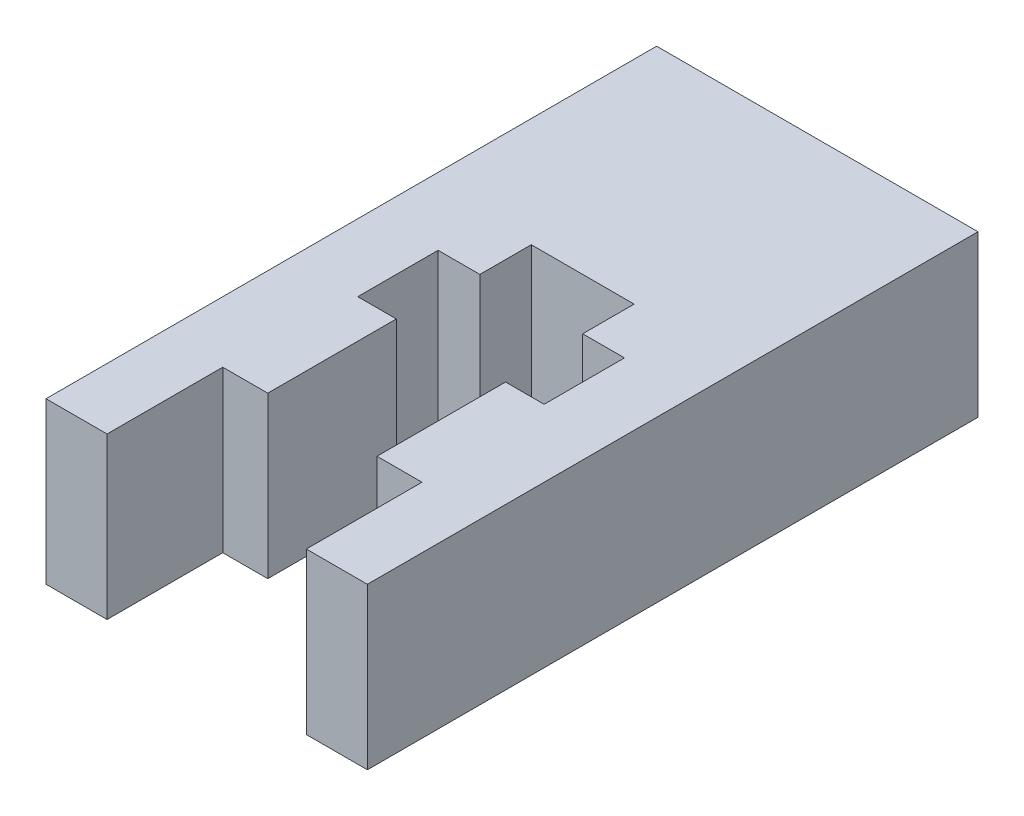
ISO-10303-21;
HEADER;
FILE_DESCRIPTION(('STEP AP214'),'2;1');
FILE_NAME('part.step','',(''),(''),'','','');
FILE_SCHEMA(('AUTOMOTIVE_DESIGN { 1 0 10303 214 1 1 1 1 }'));
ENDSEC;
DATA;
#1=APPLICATION_CONTEXT('core data for automotive mechanical design processes');
#2=APPLICATION_PROTOCOL_DEFINITION('international standard','automotive_design',2000,#1);
#3=PRODUCT_CONTEXT('',#1,'mechanical');
#4=PRODUCT('Part','Part','',(#3));
#5=PRODUCT_RELATED_PRODUCT_CATEGORY('part','',(#4));
#6=PRODUCT_DEFINITION_FORMATION('','',#4);
#7=PRODUCT_DEFINITION_CONTEXT('part definition',#1,'design');
#8=PRODUCT_DEFINITION('design','',#6,#7);
#9=PRODUCT_DEFINITION_SHAPE('','',#8);
#10=(LENGTH_UNIT() NAMED_UNIT(*) SI_UNIT(.MILLI.,.METRE.));
#11=(NAMED_UNIT(*) PLANE_ANGLE_UNIT() SI_UNIT($,.RADIAN.));
#12=(NAMED_UNIT(*) SI_UNIT($,.STERADIAN.) SOLID_ANGLE_UNIT());
#13=UNCERTAINTY_MEASURE_WITH_UNIT(LENGTH_MEASURE(1.E-05),#10,'distance_accuracy_value','');
#14=(GEOMETRIC_REPRESENTATION_CONTEXT(3) GLOBAL_UNCERTAINTY_ASSIGNED_CONTEXT((#13)) GLOBAL_UNIT_ASSIGNED_CONTEXT((#10,
#11,#12)) REPRESENTATION_CONTEXT('',''));
#15=CARTESIAN_POINT('',(0.,0.,0.));
#16=DIRECTION('',(0.,0.,1.));
#17=DIRECTION('',(1.,0.,0.));
#18=AXIS2_PLACEMENT_3D('',#15,#16,#17);
#19=CARTESIAN_POINT('',(1.6,5.,0.));
#20=DIRECTION('',(-1.,0.,0.));
#21=DIRECTION('',(0.,0.,1.));
#22=AXIS2_PLACEMENT_3D('',#19,#20,#21);
#23=PLANE('',#22);
#24=DIRECTION('',(0.,0.,-1.));
#25=VECTOR('',#24,1.);
#26=CARTESIAN_POINT('',(1.6,0.,0.));
#27=LINE('',#26,#25);
#28=CARTESIAN_POINT('',(1.6,0.,-0.600000000000002));
#29=VERTEX_POINT('',#28);
#30=CARTESIAN_POINT('',(1.6,0.,-2.2));
#31=VERTEX_POINT('',#30);
#32=EDGE_CURVE('E200',#29,#31,#27,.T.);
#33=ORIENTED_EDGE('',*,*,#32,.F.);
#34=DIRECTION('',(0.,-1.,0.));
#35=VECTOR('',#34,1.);
#36=CARTESIAN_POINT('',(1.6,5.,-0.600000000000002));
#37=LINE('',#36,#35);
#38=CARTESIAN_POINT('',(1.6,5.,-0.600000000000002));
#39=VERTEX_POINT('',#38);
#40=EDGE_CURVE('E11',#39,#29,#37,.T.);
#41=ORIENTED_EDGE('',*,*,#40,.F.);
#42=DIRECTION('',(0.,0.,-1.));
#43=VECTOR('',#42,1.);
#44=CARTESIAN_POINT('',(1.6,5.,0.));
#45=LINE('',#44,#43);
#46=CARTESIAN_POINT('',(1.6,5.,-2.2));
#47=VERTEX_POINT('',#46);
#48=EDGE_CURVE('E248',#39,#47,#45,.T.);
#49=ORIENTED_EDGE('',*,*,#48,.T.);
#50=DIRECTION('',(0.,-1.,0.));
#51=VECTOR('',#50,1.);
#52=CARTESIAN_POINT('',(1.6,5.,-2.2));
#53=LINE('',#52,#51);
#54=EDGE_CURVE('E123',#47,#31,#53,.T.);
#55=ORIENTED_EDGE('',*,*,#54,.T.);
#56=EDGE_LOOP('',(#33,#41,#49,#55));
#57=FACE_BOUND('',#56,.T.);
#58=ADVANCED_FACE('F36',(#57),#23,.T.);
#59=CARTESIAN_POINT('',(0.,5.,-0.600000000000001));
#60=DIRECTION('',(0.,0.,1.));
#61=DIRECTION('',(1.,0.,0.));
#62=AXIS2_PLACEMENT_3D('',#59,#60,#61);
#63=PLANE('',#62);
#64=DIRECTION('',(-1.,0.,0.));
#65=VECTOR('',#64,1.);
#66=CARTESIAN_POINT('',(0.,0.,-0.600000000000001));
#67=LINE('',#66,#65);
#68=CARTESIAN_POINT('',(2.9,0.,-0.600000000000003));
#69=VERTEX_POINT('',#68);
#70=EDGE_CURVE('E203',#69,#29,#67,.T.);
#71=ORIENTED_EDGE('',*,*,#70,.F.);
#72=DIRECTION('',(0.,-1.,0.));
#73=VECTOR('',#72,1.);
#74=CARTESIAN_POINT('',(2.9,5.,-0.600000000000003));
#75=LINE('',#74,#73);
#76=CARTESIAN_POINT('',(2.9,5.,-0.600000000000003));
#77=VERTEX_POINT('',#76);
#78=EDGE_CURVE('E44',#77,#69,#75,.T.);
#79=ORIENTED_EDGE('',*,*,#78,.F.);
#80=DIRECTION('',(-1.,0.,0.));
#81=VECTOR('',#80,1.);
#82=CARTESIAN_POINT('',(0.,5.,-0.600000000000001));
#83=LINE('',#82,#81);
#84=EDGE_CURVE('E307',#77,#39,#83,.T.);
#85=ORIENTED_EDGE('',*,*,#84,.T.);
#86=ORIENTED_EDGE('',*,*,#40,.T.);
#87=EDGE_LOOP('',(#71,#79,#85,#86));
#88=FACE_BOUND('',#87,.T.);
#89=ADVANCED_FACE('F295',(#88),#63,.T.);
#90=CARTESIAN_POINT('',(2.9,5.,0.));
#91=DIRECTION('',(-1.,0.,0.));
#92=DIRECTION('',(0.,0.,1.));
#93=AXIS2_PLACEMENT_3D('',#90,#91,#92);
#94=PLANE('',#93);
#95=DIRECTION('',(0.,0.,-1.));
#96=VECTOR('',#95,1.);
#97=CARTESIAN_POINT('',(2.9,0.,0.));
#98=LINE('',#97,#96);
#99=CARTESIAN_POINT('',(2.9,0.,1.9));
#100=VERTEX_POINT('',#99);
#101=EDGE_CURVE('E206',#100,#69,#98,.T.);
#102=ORIENTED_EDGE('',*,*,#101,.F.);
#103=DIRECTION('',(0.,-1.,0.));
#104=VECTOR('',#103,1.);
#105=CARTESIAN_POINT('',(2.9,5.,1.9));
#106=LINE('',#105,#104);
#107=CARTESIAN_POINT('',(2.9,5.,1.9));
#108=VERTEX_POINT('',#107);
#109=EDGE_CURVE('E284',#108,#100,#106,.T.);
#110=ORIENTED_EDGE('',*,*,#109,.F.);
#111=DIRECTION('',(0.,0.,-1.));
#112=VECTOR('',#111,1.);
#113=CARTESIAN_POINT('',(2.9,5.,0.));
#114=LINE('',#113,#112);
#115=EDGE_CURVE('E291',#108,#77,#114,.T.);
#116=ORIENTED_EDGE('',*,*,#115,.T.);
#117=ORIENTED_EDGE('',*,*,#78,.T.);
#118=EDGE_LOOP('',(#102,#110,#116,#117));
#119=FACE_BOUND('',#118,.T.);
#120=ADVANCED_FACE('F289',(#119),#94,.T.);
#121=CARTESIAN_POINT('',(0.,5.,1.9));
#122=DIRECTION('',(0.,0.,-1.));
#123=DIRECTION('',(-1.,0.,0.));
#124=AXIS2_PLACEMENT_3D('',#121,#122,#123);
#125=PLANE('',#124);
#126=DIRECTION('',(1.,0.,0.));
#127=VECTOR('',#126,1.);
#128=CARTESIAN_POINT('',(0.,0.,1.9));
#129=LINE('',#128,#127);
#130=CARTESIAN_POINT('',(1.7,0.,1.9));
#131=VERTEX_POINT('',#130);
#132=EDGE_CURVE('E209',#131,#100,#129,.T.);
#133=ORIENTED_EDGE('',*,*,#132,.F.);
#134=DIRECTION('',(0.,-1.,0.));
#135=VECTOR('',#134,1.);
#136=CARTESIAN_POINT('',(1.7,5.,1.9));
#137=LINE('',#136,#135);
#138=CARTESIAN_POINT('',(1.7,5.,1.9));
#139=VERTEX_POINT('',#138);
#140=EDGE_CURVE('E282',#139,#131,#137,.T.);
#141=ORIENTED_EDGE('',*,*,#140,.F.);
#142=DIRECTION('',(1.,0.,0.));
#143=VECTOR('',#142,1.);
#144=CARTESIAN_POINT('',(0.,5.,1.9));
#145=LINE('',#144,#143);
#146=EDGE_CURVE('E304',#139,#108,#145,.T.);
#147=ORIENTED_EDGE('',*,*,#146,.T.);
#148=ORIENTED_EDGE('',*,*,#109,.T.);
#149=EDGE_LOOP('',(#133,#141,#147,#148));
#150=FACE_BOUND('',#149,.T.);
#151=ADVANCED_FACE('F301',(#150),#125,.T.);
#152=CARTESIAN_POINT('',(1.7,5.,0.));
#153=DIRECTION('',(-1.,0.,0.));
#154=DIRECTION('',(0.,0.,1.));
#155=AXIS2_PLACEMENT_3D('',#152,#153,#154);
#156=PLANE('',#155);
#157=DIRECTION('',(0.,0.,-1.));
#158=VECTOR('',#157,1.);
#159=CARTESIAN_POINT('',(1.7,0.,0.));
#160=LINE('',#159,#158);
#161=CARTESIAN_POINT('',(1.7,0.,5.9));
#162=VERTEX_POINT('',#161);
#163=EDGE_CURVE('E212',#162,#131,#160,.T.);
#164=ORIENTED_EDGE('',*,*,#163,.F.);
#165=DIRECTION('',(0.,-1.,0.));
#166=VECTOR('',#165,1.);
#167=CARTESIAN_POINT('',(1.7,5.,5.9));
#168=LINE('',#167,#166);
#169=CARTESIAN_POINT('',(1.7,5.,5.9));
#170=VERTEX_POINT('',#169);
#171=EDGE_CURVE('E280',#170,#162,#168,.T.);
#172=ORIENTED_EDGE('',*,*,#171,.F.);
#173=DIRECTION('',(0.,0.,-1.));
#174=VECTOR('',#173,1.);
#175=CARTESIAN_POINT('',(1.7,5.,0.));
#176=LINE('',#175,#174);
#177=EDGE_CURVE('E309',#170,#139,#176,.T.);
#178=ORIENTED_EDGE('',*,*,#177,.T.);
#179=ORIENTED_EDGE('',*,*,#140,.T.);
#180=EDGE_LOOP('',(#164,#172,#178,#179));
#181=FACE_BOUND('',#180,.T.);
#182=ADVANCED_FACE('F364',(#181),#156,.T.);
#183=CARTESIAN_POINT('',(0.,5.,5.9));
#184=DIRECTION('',(0.,0.,1.));
#185=DIRECTION('',(1.,0.,0.));
#186=AXIS2_PLACEMENT_3D('',#183,#184,#185);
#187=PLANE('',#186);
#188=DIRECTION('',(-1.,0.,0.));
#189=VECTOR('',#188,1.);
#190=CARTESIAN_POINT('',(0.,0.,5.9));
#191=LINE('',#190,#189);
#192=CARTESIAN_POINT('',(3.1,0.,5.9));
#193=VERTEX_POINT('',#192);
#194=EDGE_CURVE('E215',#193,#162,#191,.T.);
#195=ORIENTED_EDGE('',*,*,#194,.F.);
#196=DIRECTION('',(0.,-1.,0.));
#197=VECTOR('',#196,1.);
#198=CARTESIAN_POINT('',(3.1,5.,5.9));
#199=LINE('',#198,#197);
#200=CARTESIAN_POINT('',(3.1,5.,5.9));
#201=VERTEX_POINT('',#200);
#202=EDGE_CURVE('E278',#201,#193,#199,.T.);
#203=ORIENTED_EDGE('',*,*,#202,.F.);
#204=DIRECTION('',(-1.,0.,0.));
#205=VECTOR('',#204,1.);
#206=CARTESIAN_POINT('',(0.,5.,5.9));
#207=LINE('',#206,#205);
#208=EDGE_CURVE('E315',#201,#170,#207,.T.);
#209=ORIENTED_EDGE('',*,*,#208,.T.);
#210=ORIENTED_EDGE('',*,*,#171,.T.);
#211=EDGE_LOOP('',(#195,#203,#209,#210));
#212=FACE_BOUND('',#211,.T.);
#213=ADVANCED_FACE('F367',(#212),#187,.T.);
#214=CARTESIAN_POINT('',(3.1,5.,0.));
#215=DIRECTION('',(-1.,0.,0.));
#216=DIRECTION('',(0.,0.,1.));
#217=AXIS2_PLACEMENT_3D('',#214,#215,#216);
#218=PLANE('',#217);
#219=DIRECTION('',(0.,0.,-1.));
#220=VECTOR('',#219,1.);
#221=CARTESIAN_POINT('',(3.1,0.,0.));
#222=LINE('',#221,#220);
#223=CARTESIAN_POINT('',(3.1,0.,9.5));
#224=VERTEX_POINT('',#223);
#225=EDGE_CURVE('E218',#224,#193,#222,.T.);
#226=ORIENTED_EDGE('',*,*,#225,.F.);
#227=DIRECTION('',(0.,-1.,0.));
#228=VECTOR('',#227,1.);
#229=CARTESIAN_POINT('',(3.1,5.,9.5));
#230=LINE('',#229,#228);
#231=CARTESIAN_POINT('',(3.1,5.,9.5));
#232=VERTEX_POINT('',#231);
#233=EDGE_CURVE('E276',#232,#224,#230,.T.);
#234=ORIENTED_EDGE('',*,*,#233,.F.);
#235=DIRECTION('',(0.,0.,-1.));
#236=VECTOR('',#235,1.);
#237=CARTESIAN_POINT('',(3.1,5.,0.));
#238=LINE('',#237,#236);
#239=EDGE_CURVE('E318',#232,#201,#238,.T.);
#240=ORIENTED_EDGE('',*,*,#239,.T.);
#241=ORIENTED_EDGE('',*,*,#202,.T.);
#242=EDGE_LOOP('',(#226,#234,#240,#241));
#243=FACE_BOUND('',#242,.T.);
#244=ADVANCED_FACE('F371',(#243),#218,.T.);
#245=CARTESIAN_POINT('',(0.,5.,9.5));
#246=DIRECTION('',(0.,0.,-1.));
#247=DIRECTION('',(-1.,0.,0.));
#248=AXIS2_PLACEMENT_3D('',#245,#246,#247);
#249=PLANE('',#248);
#250=DIRECTION('',(1.,0.,0.));
#251=VECTOR('',#250,1.);
#252=CARTESIAN_POINT('',(0.,0.,9.5));
#253=LINE('',#252,#251);
#254=CARTESIAN_POINT('',(5.,0.,9.5));
#255=VERTEX_POINT('',#254);
#256=EDGE_CURVE('E221',#224,#255,#253,.T.);
#257=ORIENTED_EDGE('',*,*,#256,.T.);
#258=DIRECTION('',(0.,-1.,0.));
#259=VECTOR('',#258,1.);
#260=CARTESIAN_POINT('',(5.,5.,9.5));
#261=LINE('',#260,#259);
#262=CARTESIAN_POINT('',(5.,5.,9.5));
#263=VERTEX_POINT('',#262);
#264=EDGE_CURVE('E273',#263,#255,#261,.T.);
#265=ORIENTED_EDGE('',*,*,#264,.F.);
#266=DIRECTION('',(1.,0.,0.));
#267=VECTOR('',#266,1.);
#268=CARTESIAN_POINT('',(0.,5.,9.5));
#269=LINE('',#268,#267);
#270=EDGE_CURVE('E321',#232,#263,#269,.T.);
#271=ORIENTED_EDGE('',*,*,#270,.F.);
#272=ORIENTED_EDGE('',*,*,#233,.T.);
#273=EDGE_LOOP('',(#257,#265,#271,#272));
#274=FACE_BOUND('',#273,.T.);
#275=ADVANCED_FACE('F375',(#274),#249,.F.);
#276=CARTESIAN_POINT('',(5.,5.,0.));
#277=DIRECTION('',(-1.,0.,0.));
#278=DIRECTION('',(0.,0.,1.));
#279=AXIS2_PLACEMENT_3D('',#276,#277,#278);
#280=PLANE('',#279);
#281=DIRECTION('',(0.,0.,-1.));
#282=VECTOR('',#281,1.);
#283=CARTESIAN_POINT('',(5.,0.,0.));
#284=LINE('',#283,#282);
#285=CARTESIAN_POINT('',(5.,0.,-9.5));
#286=VERTEX_POINT('',#285);
#287=EDGE_CURVE('E223',#255,#286,#284,.T.);
#288=ORIENTED_EDGE('',*,*,#287,.T.);
#289=DIRECTION('',(0.,-1.,0.));
#290=VECTOR('',#289,1.);
#291=CARTESIAN_POINT('',(5.,5.,-9.5));
#292=LINE('',#291,#290);
#293=CARTESIAN_POINT('',(5.,5.,-9.5));
#294=VERTEX_POINT('',#293);
#295=EDGE_CURVE('E271',#294,#286,#292,.T.);
#296=ORIENTED_EDGE('',*,*,#295,.F.);
#297=DIRECTION('',(0.,0.,-1.));
#298=VECTOR('',#297,1.);
#299=CARTESIAN_POINT('',(5.,5.,0.));
#300=LINE('',#299,#298);
#301=EDGE_CURVE('E323',#263,#294,#300,.T.);
#302=ORIENTED_EDGE('',*,*,#301,.F.);
#303=ORIENTED_EDGE('',*,*,#264,.T.);
#304=EDGE_LOOP('',(#288,#296,#302,#303));
#305=FACE_BOUND('',#304,.T.);
#306=ADVANCED_FACE('F379',(#305),#280,.F.);
#307=CARTESIAN_POINT('',(0.,5.,-9.5));
#308=DIRECTION('',(0.,0.,-1.));
#309=DIRECTION('',(-1.,0.,0.));
#310=AXIS2_PLACEMENT_3D('',#307,#308,#309);
#311=PLANE('',#310);
#312=DIRECTION('',(1.,0.,0.));
#313=VECTOR('',#312,1.);
#314=CARTESIAN_POINT('',(0.,0.,-9.5));
#315=LINE('',#314,#313);
#316=CARTESIAN_POINT('',(-5.,0.,-9.5));
#317=VERTEX_POINT('',#316);
#318=EDGE_CURVE('E226',#317,#286,#315,.T.);
#319=ORIENTED_EDGE('',*,*,#318,.F.);
#320=DIRECTION('',(0.,-1.,0.));
#321=VECTOR('',#320,1.);
#322=CARTESIAN_POINT('',(-5.,5.,-9.5));
#323=LINE('',#322,#321);
#324=CARTESIAN_POINT('',(-5.,5.,-9.5));
#325=VERTEX_POINT('',#324);
#326=EDGE_CURVE('E269',#325,#317,#323,.T.);
#327=ORIENTED_EDGE('',*,*,#326,.F.);
#328=DIRECTION('',(1.,0.,0.));
#329=VECTOR('',#328,1.);
#330=CARTESIAN_POINT('',(0.,5.,-9.5));
#331=LINE('',#330,#329);
#332=EDGE_CURVE('E325',#325,#294,#331,.T.);
#333=ORIENTED_EDGE('',*,*,#332,.T.);
#334=ORIENTED_EDGE('',*,*,#295,.T.);
#335=EDGE_LOOP('',(#319,#327,#333,#334));
#336=FACE_BOUND('',#335,.T.);
#337=ADVANCED_FACE('F383',(#336),#311,.T.);
#338=CARTESIAN_POINT('',(-5.,5.,0.));
#339=DIRECTION('',(-1.,0.,0.));
#340=DIRECTION('',(0.,0.,1.));
#341=AXIS2_PLACEMENT_3D('',#338,#339,#340);
#342=PLANE('',#341);
#343=DIRECTION('',(0.,0.,-1.));
#344=VECTOR('',#343,1.);
#345=CARTESIAN_POINT('',(-5.,0.,0.));
#346=LINE('',#345,#344);
#347=CARTESIAN_POINT('',(-5.,0.,9.5));
#348=VERTEX_POINT('',#347);
#349=EDGE_CURVE('E229',#348,#317,#346,.T.);
#350=ORIENTED_EDGE('',*,*,#349,.F.);
#351=DIRECTION('',(0.,-1.,0.));
#352=VECTOR('',#351,1.);
#353=CARTESIAN_POINT('',(-5.,5.,9.5));
#354=LINE('',#353,#352);
#355=CARTESIAN_POINT('',(-5.,5.,9.5));
#356=VERTEX_POINT('',#355);
#357=EDGE_CURVE('E267',#356,#348,#354,.T.);
#358=ORIENTED_EDGE('',*,*,#357,.F.);
#359=DIRECTION('',(0.,0.,-1.));
#360=VECTOR('',#359,1.);
#361=CARTESIAN_POINT('',(-5.,5.,0.));
#362=LINE('',#361,#360);
#363=EDGE_CURVE('E328',#356,#325,#362,.T.);
#364=ORIENTED_EDGE('',*,*,#363,.T.);
#365=ORIENTED_EDGE('',*,*,#326,.T.);
#366=EDGE_LOOP('',(#350,#358,#364,#365));
#367=FACE_BOUND('',#366,.T.);
#368=ADVANCED_FACE('F387',(#367),#342,.T.);
#369=CARTESIAN_POINT('',(0.,5.,9.5));
#370=DIRECTION('',(0.,0.,-1.));
#371=DIRECTION('',(-1.,0.,0.));
#372=AXIS2_PLACEMENT_3D('',#369,#370,#371);
#373=PLANE('',#372);
#374=DIRECTION('',(1.,0.,0.));
#375=VECTOR('',#374,1.);
#376=CARTESIAN_POINT('',(0.,0.,9.5));
#377=LINE('',#376,#375);
#378=CARTESIAN_POINT('',(-3.1,0.,9.5));
#379=VERTEX_POINT('',#378);
#380=EDGE_CURVE('E232',#348,#379,#377,.T.);
#381=ORIENTED_EDGE('',*,*,#380,.T.);
#382=DIRECTION('',(0.,-1.,0.));
#383=VECTOR('',#382,1.);
#384=CARTESIAN_POINT('',(-3.1,5.,9.5));
#385=LINE('',#384,#383);
#386=CARTESIAN_POINT('',(-3.1,5.,9.5));
#387=VERTEX_POINT('',#386);
#388=EDGE_CURVE('E264',#387,#379,#385,.T.);
#389=ORIENTED_EDGE('',*,*,#388,.F.);
#390=DIRECTION('',(1.,0.,0.));
#391=VECTOR('',#390,1.);
#392=CARTESIAN_POINT('',(0.,5.,9.5));
#393=LINE('',#392,#391);
#394=EDGE_CURVE('E331',#356,#387,#393,.T.);
#395=ORIENTED_EDGE('',*,*,#394,.F.);
#396=ORIENTED_EDGE('',*,*,#357,.T.);
#397=EDGE_LOOP('',(#381,#389,#395,#396));
#398=FACE_BOUND('',#397,.T.);
#399=ADVANCED_FACE('F391',(#398),#373,.F.);
#400=CARTESIAN_POINT('',(-3.1,5.,0.));
#401=DIRECTION('',(-1.,0.,0.));
#402=DIRECTION('',(0.,0.,1.));
#403=AXIS2_PLACEMENT_3D('',#400,#401,#402);
#404=PLANE('',#403);
#405=DIRECTION('',(0.,0.,-1.));
#406=VECTOR('',#405,1.);
#407=CARTESIAN_POINT('',(-3.1,0.,0.));
#408=LINE('',#407,#406);
#409=CARTESIAN_POINT('',(-3.1,0.,5.9));
#410=VERTEX_POINT('',#409);
#411=EDGE_CURVE('E234',#379,#410,#408,.T.);
#412=ORIENTED_EDGE('',*,*,#411,.T.);
#413=DIRECTION('',(0.,-1.,0.));
#414=VECTOR('',#413,1.);
#415=CARTESIAN_POINT('',(-3.1,5.,5.9));
#416=LINE('',#415,#414);
#417=CARTESIAN_POINT('',(-3.1,5.,5.9));
#418=VERTEX_POINT('',#417);
#419=EDGE_CURVE('E261',#418,#410,#416,.T.);
#420=ORIENTED_EDGE('',*,*,#419,.F.);
#421=DIRECTION('',(0.,0.,-1.));
#422=VECTOR('',#421,1.);
#423=CARTESIAN_POINT('',(-3.1,5.,0.));
#424=LINE('',#423,#422);
#425=EDGE_CURVE('E333',#387,#418,#424,.T.);
#426=ORIENTED_EDGE('',*,*,#425,.F.);
#427=ORIENTED_EDGE('',*,*,#388,.T.);
#428=EDGE_LOOP('',(#412,#420,#426,#427));
#429=FACE_BOUND('',#428,.T.);
#430=ADVANCED_FACE('F395',(#429),#404,.F.);
#431=CARTESIAN_POINT('',(0.,5.,5.9));
#432=DIRECTION('',(0.,0.,-1.));
#433=DIRECTION('',(-1.,0.,0.));
#434=AXIS2_PLACEMENT_3D('',#431,#432,#433);
#435=PLANE('',#434);
#436=DIRECTION('',(1.,0.,0.));
#437=VECTOR('',#436,1.);
#438=CARTESIAN_POINT('',(0.,0.,5.9));
#439=LINE('',#438,#437);
#440=CARTESIAN_POINT('',(-1.7,0.,5.9));
#441=VERTEX_POINT('',#440);
#442=EDGE_CURVE('E236',#410,#441,#439,.T.);
#443=ORIENTED_EDGE('',*,*,#442,.T.);
#444=DIRECTION('',(0.,-1.,0.));
#445=VECTOR('',#444,1.);
#446=CARTESIAN_POINT('',(-1.7,5.,5.9));
#447=LINE('',#446,#445);
#448=CARTESIAN_POINT('',(-1.7,5.,5.9));
#449=VERTEX_POINT('',#448);
#450=EDGE_CURVE('E258',#449,#441,#447,.T.);
#451=ORIENTED_EDGE('',*,*,#450,.F.);
#452=DIRECTION('',(1.,0.,0.));
#453=VECTOR('',#452,1.);
#454=CARTESIAN_POINT('',(0.,5.,5.9));
#455=LINE('',#454,#453);
#456=EDGE_CURVE('E335',#418,#449,#455,.T.);
#457=ORIENTED_EDGE('',*,*,#456,.F.);
#458=ORIENTED_EDGE('',*,*,#419,.T.);
#459=EDGE_LOOP('',(#443,#451,#457,#458));
#460=FACE_BOUND('',#459,.T.);
#461=ADVANCED_FACE('F399',(#460),#435,.F.);
#462=CARTESIAN_POINT('',(-1.7,5.,0.));
#463=DIRECTION('',(-1.,0.,0.));
#464=DIRECTION('',(0.,0.,1.));
#465=AXIS2_PLACEMENT_3D('',#462,#463,#464);
#466=PLANE('',#465);
#467=DIRECTION('',(0.,0.,-1.));
#468=VECTOR('',#467,1.);
#469=CARTESIAN_POINT('',(-1.7,0.,0.));
#470=LINE('',#469,#468);
#471=CARTESIAN_POINT('',(-1.7,0.,1.9));
#472=VERTEX_POINT('',#471);
#473=EDGE_CURVE('E238',#441,#472,#470,.T.);
#474=ORIENTED_EDGE('',*,*,#473,.T.);
#475=DIRECTION('',(0.,-1.,0.));
#476=VECTOR('',#475,1.);
#477=CARTESIAN_POINT('',(-1.7,5.,1.9));
#478=LINE('',#477,#476);
#479=CARTESIAN_POINT('',(-1.7,5.,1.9));
#480=VERTEX_POINT('',#479);
#481=EDGE_CURVE('E255',#480,#472,#478,.T.);
#482=ORIENTED_EDGE('',*,*,#481,.F.);
#483=DIRECTION('',(0.,0.,-1.));
#484=VECTOR('',#483,1.);
#485=CARTESIAN_POINT('',(-1.7,5.,0.));
#486=LINE('',#485,#484);
#487=EDGE_CURVE('E337',#449,#480,#486,.T.);
#488=ORIENTED_EDGE('',*,*,#487,.F.);
#489=ORIENTED_EDGE('',*,*,#450,.T.);
#490=EDGE_LOOP('',(#474,#482,#488,#489));
#491=FACE_BOUND('',#490,.T.);
#492=ADVANCED_FACE('F403',(#491),#466,.F.);
#493=CARTESIAN_POINT('',(0.,5.,1.9));
#494=DIRECTION('',(0.,0.,1.));
#495=DIRECTION('',(1.,0.,0.));
#496=AXIS2_PLACEMENT_3D('',#493,#494,#495);
#497=PLANE('',#496);
#498=DIRECTION('',(-1.,0.,0.));
#499=VECTOR('',#498,1.);
#500=CARTESIAN_POINT('',(0.,0.,1.9));
#501=LINE('',#500,#499);
#502=CARTESIAN_POINT('',(-2.9,0.,1.9));
#503=VERTEX_POINT('',#502);
#504=EDGE_CURVE('E240',#472,#503,#501,.T.);
#505=ORIENTED_EDGE('',*,*,#504,.T.);
#506=DIRECTION('',(0.,-1.,0.));
#507=VECTOR('',#506,1.);
#508=CARTESIAN_POINT('',(-2.9,5.,1.9));
#509=LINE('',#508,#507);
#510=CARTESIAN_POINT('',(-2.9,5.,1.9));
#511=VERTEX_POINT('',#510);
#512=EDGE_CURVE('E252',#511,#503,#509,.T.);
#513=ORIENTED_EDGE('',*,*,#512,.F.);
#514=DIRECTION('',(-1.,0.,0.));
#515=VECTOR('',#514,1.);
#516=CARTESIAN_POINT('',(0.,5.,1.9));
#517=LINE('',#516,#515);
#518=EDGE_CURVE('E339',#480,#511,#517,.T.);
#519=ORIENTED_EDGE('',*,*,#518,.F.);
#520=ORIENTED_EDGE('',*,*,#481,.T.);
#521=EDGE_LOOP('',(#505,#513,#519,#520));
#522=FACE_BOUND('',#521,.T.);
#523=ADVANCED_FACE('F345',(#522),#497,.F.);
#524=CARTESIAN_POINT('',(-2.9,5.,0.));
#525=DIRECTION('',(-1.,0.,0.));
#526=DIRECTION('',(0.,0.,1.));
#527=AXIS2_PLACEMENT_3D('',#524,#525,#526);
#528=PLANE('',#527);
#529=DIRECTION('',(0.,0.,-1.));
#530=VECTOR('',#529,1.);
#531=CARTESIAN_POINT('',(-2.9,0.,0.));
#532=LINE('',#531,#530);
#533=CARTESIAN_POINT('',(-2.9,0.,-0.600000000000002));
#534=VERTEX_POINT('',#533);
#535=EDGE_CURVE('E242',#503,#534,#532,.T.);
#536=ORIENTED_EDGE('',*,*,#535,.T.);
#537=DIRECTION('',(0.,-1.,0.));
#538=VECTOR('',#537,1.);
#539=CARTESIAN_POINT('',(-2.9,5.,-0.600000000000002));
#540=LINE('',#539,#538);
#541=CARTESIAN_POINT('',(-2.9,5.,-0.600000000000002));
#542=VERTEX_POINT('',#541);
#543=EDGE_CURVE('E192',#542,#534,#540,.T.);
#544=ORIENTED_EDGE('',*,*,#543,.F.);
#545=DIRECTION('',(0.,0.,-1.));
#546=VECTOR('',#545,1.);
#547=CARTESIAN_POINT('',(-2.9,5.,0.));
#548=LINE('',#547,#546);
#549=EDGE_CURVE('E183',#511,#542,#548,.T.);
#550=ORIENTED_EDGE('',*,*,#549,.F.);
#551=ORIENTED_EDGE('',*,*,#512,.T.);
#552=EDGE_LOOP('',(#536,#544,#550,#551));
#553=FACE_BOUND('',#552,.T.);
#554=ADVANCED_FACE('F349',(#553),#528,.F.);
#555=CARTESIAN_POINT('',(0.,5.,-0.600000000000001));
#556=DIRECTION('',(0.,0.,-1.));
#557=DIRECTION('',(-1.,0.,0.));
#558=AXIS2_PLACEMENT_3D('',#555,#556,#557);
#559=PLANE('',#558);
#560=DIRECTION('',(1.,0.,0.));
#561=VECTOR('',#560,1.);
#562=CARTESIAN_POINT('',(0.,0.,-0.600000000000001));
#563=LINE('',#562,#561);
#564=CARTESIAN_POINT('',(-1.6,0.,-0.600000000000002));
#565=VERTEX_POINT('',#564);
#566=EDGE_CURVE('E191',#534,#565,#563,.T.);
#567=ORIENTED_EDGE('',*,*,#566,.T.);
#568=DIRECTION('',(0.,-1.,0.));
#569=VECTOR('',#568,1.);
#570=CARTESIAN_POINT('',(-1.6,5.,-0.600000000000002));
#571=LINE('',#570,#569);
#572=CARTESIAN_POINT('',(-1.6,5.,-0.600000000000002));
#573=VERTEX_POINT('',#572);
#574=EDGE_CURVE('E188',#573,#565,#571,.T.);
#575=ORIENTED_EDGE('',*,*,#574,.F.);
#576=DIRECTION('',(1.,0.,0.));
#577=VECTOR('',#576,1.);
#578=CARTESIAN_POINT('',(0.,5.,-0.600000000000001));
#579=LINE('',#578,#577);
#580=EDGE_CURVE('E177',#542,#573,#579,.T.);
#581=ORIENTED_EDGE('',*,*,#580,.F.);
#582=ORIENTED_EDGE('',*,*,#543,.T.);
#583=EDGE_LOOP('',(#567,#575,#581,#582));
#584=FACE_BOUND('',#583,.T.);
#585=ADVANCED_FACE('F189',(#584),#559,.F.);
#586=CARTESIAN_POINT('',(-1.6,5.,0.));
#587=DIRECTION('',(-1.,0.,0.));
#588=DIRECTION('',(0.,0.,1.));
#589=AXIS2_PLACEMENT_3D('',#586,#587,#588);
#590=PLANE('',#589);
#591=DIRECTION('',(0.,0.,-1.));
#592=VECTOR('',#591,1.);
#593=CARTESIAN_POINT('',(-1.6,0.,0.));
#594=LINE('',#593,#592);
#595=CARTESIAN_POINT('',(-1.6,0.,-2.2));
#596=VERTEX_POINT('',#595);
#597=EDGE_CURVE('E116',#565,#596,#594,.T.);
#598=ORIENTED_EDGE('',*,*,#597,.T.);
#599=DIRECTION('',(0.,-1.,0.));
#600=VECTOR('',#599,1.);
#601=CARTESIAN_POINT('',(-1.6,5.,-2.2));
#602=LINE('',#601,#600);
#603=CARTESIAN_POINT('',(-1.6,5.,-2.2));
#604=VERTEX_POINT('',#603);
#605=EDGE_CURVE('E193',#604,#596,#602,.T.);
#606=ORIENTED_EDGE('',*,*,#605,.F.);
#607=DIRECTION('',(0.,0.,-1.));
#608=VECTOR('',#607,1.);
#609=CARTESIAN_POINT('',(-1.6,5.,0.));
#610=LINE('',#609,#608);
#611=EDGE_CURVE('E181',#573,#604,#610,.T.);
#612=ORIENTED_EDGE('',*,*,#611,.F.);
#613=ORIENTED_EDGE('',*,*,#574,.T.);
#614=EDGE_LOOP('',(#598,#606,#612,#613));
#615=FACE_BOUND('',#614,.T.);
#616=ADVANCED_FACE('F195',(#615),#590,.F.);
#617=CARTESIAN_POINT('',(0.,5.,-2.2));
#618=DIRECTION('',(0.,0.,-1.));
#619=DIRECTION('',(-1.,0.,0.));
#620=AXIS2_PLACEMENT_3D('',#617,#618,#619);
#621=PLANE('',#620);
#622=DIRECTION('',(1.,0.,0.));
#623=VECTOR('',#622,1.);
#624=CARTESIAN_POINT('',(0.,0.,-2.2));
#625=LINE('',#624,#623);
#626=EDGE_CURVE('E246',#596,#31,#625,.T.);
#627=ORIENTED_EDGE('',*,*,#626,.T.);
#628=ORIENTED_EDGE('',*,*,#54,.F.);
#629=DIRECTION('',(1.,0.,0.));
#630=VECTOR('',#629,1.);
#631=CARTESIAN_POINT('',(0.,5.,-2.2));
#632=LINE('',#631,#630);
#633=EDGE_CURVE('E52',#604,#47,#632,.T.);
#634=ORIENTED_EDGE('',*,*,#633,.F.);
#635=ORIENTED_EDGE('',*,*,#605,.T.);
#636=EDGE_LOOP('',(#627,#628,#634,#635));
#637=FACE_BOUND('',#636,.T.);
#638=ADVANCED_FACE('F352',(#637),#621,.F.);
#639=CARTESIAN_POINT('',(0.,5.,0.));
#640=DIRECTION('',(0.,1.,0.));
#641=DIRECTION('',(0.,0.,1.));
#642=AXIS2_PLACEMENT_3D('',#639,#640,#641);
#643=PLANE('',#642);
#644=ORIENTED_EDGE('',*,*,#48,.F.);
#645=ORIENTED_EDGE('',*,*,#84,.F.);
#646=ORIENTED_EDGE('',*,*,#115,.F.);
#647=ORIENTED_EDGE('',*,*,#146,.F.);
#648=ORIENTED_EDGE('',*,*,#177,.F.);
#649=ORIENTED_EDGE('',*,*,#208,.F.);
#650=ORIENTED_EDGE('',*,*,#239,.F.);
#651=ORIENTED_EDGE('',*,*,#270,.T.);
#652=ORIENTED_EDGE('',*,*,#301,.T.);
#653=ORIENTED_EDGE('',*,*,#332,.F.);
#654=ORIENTED_EDGE('',*,*,#363,.F.);
#655=ORIENTED_EDGE('',*,*,#394,.T.);
#656=ORIENTED_EDGE('',*,*,#425,.T.);
#657=ORIENTED_EDGE('',*,*,#456,.T.);
#658=ORIENTED_EDGE('',*,*,#487,.T.);
#659=ORIENTED_EDGE('',*,*,#518,.T.);
#660=ORIENTED_EDGE('',*,*,#549,.T.);
#661=ORIENTED_EDGE('',*,*,#580,.T.);
#662=ORIENTED_EDGE('',*,*,#611,.T.);
#663=ORIENTED_EDGE('',*,*,#633,.T.);
#664=EDGE_LOOP('',(#644,#645,#646,#647,#648,#649,#650,#651,#652,#653,#654,#655,#656,#657,#658,
#659,#660,#661,#662,#663));
#665=FACE_BOUND('',#664,.T.);
#666=ADVANCED_FACE('F179',(#665),#643,.T.);
#667=CARTESIAN_POINT('',(0.,0.,0.));
#668=DIRECTION('',(0.,1.,0.));
#669=DIRECTION('',(0.,0.,1.));
#670=AXIS2_PLACEMENT_3D('',#667,#668,#669);
#671=PLANE('',#670);
#672=ORIENTED_EDGE('',*,*,#32,.T.);
#673=ORIENTED_EDGE('',*,*,#626,.F.);
#674=ORIENTED_EDGE('',*,*,#597,.F.);
#675=ORIENTED_EDGE('',*,*,#566,.F.);
#676=ORIENTED_EDGE('',*,*,#535,.F.);
#677=ORIENTED_EDGE('',*,*,#504,.F.);
#678=ORIENTED_EDGE('',*,*,#473,.F.);
#679=ORIENTED_EDGE('',*,*,#442,.F.);
#680=ORIENTED_EDGE('',*,*,#411,.F.);
#681=ORIENTED_EDGE('',*,*,#380,.F.);
#682=ORIENTED_EDGE('',*,*,#349,.T.);
#683=ORIENTED_EDGE('',*,*,#318,.T.);
#684=ORIENTED_EDGE('',*,*,#287,.F.);
#685=ORIENTED_EDGE('',*,*,#256,.F.);
#686=ORIENTED_EDGE('',*,*,#225,.T.);
#687=ORIENTED_EDGE('',*,*,#194,.T.);
#688=ORIENTED_EDGE('',*,*,#163,.T.);
#689=ORIENTED_EDGE('',*,*,#132,.T.);
#690=ORIENTED_EDGE('',*,*,#101,.T.);
#691=ORIENTED_EDGE('',*,*,#70,.T.);
#692=EDGE_LOOP('',(#672,#673,#674,#675,#676,#677,#678,#679,#680,#681,#682,#683,#684,#685,#686,
#687,#688,#689,#690,#691));
#693=FACE_BOUND('',#692,.T.);
#694=ADVANCED_FACE('F297',(#693),#671,.F.);
#695=CLOSED_SHELL('',(#58,#89,#120,#151,#182,#213,#244,#275,#306,#337,#368,#399,#430,#461,#492,
#523,#554,#585,#616,#638,#666,#694));
#696=MANIFOLD_SOLID_BREP('B2',#695);
#697=ADVANCED_BREP_SHAPE_REPRESENTATION('',(#18,#696),#14);
#698=SHAPE_DEFINITION_REPRESENTATION(#9,#697);
ENDSEC;
END-ISO-10303-21;
